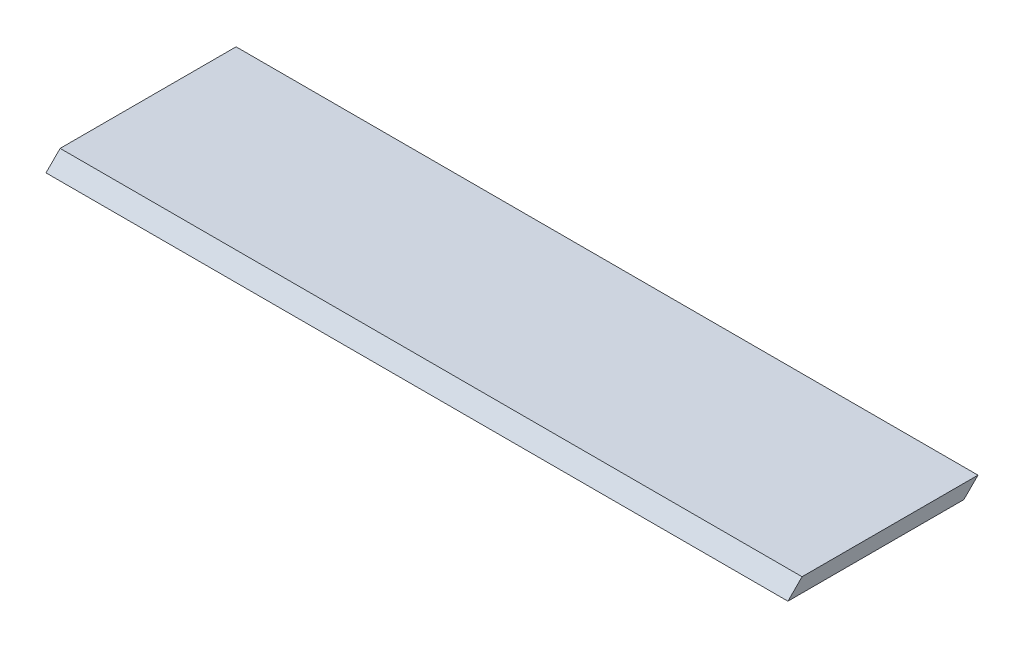
ISO-10303-21;
HEADER;
FILE_DESCRIPTION(('STEP AP214'),'2;1');
FILE_NAME('part.step','',(''),(''),'','','');
FILE_SCHEMA(('AUTOMOTIVE_DESIGN { 1 0 10303 214 1 1 1 1 }'));
ENDSEC;
DATA;
#1=APPLICATION_CONTEXT('core data for automotive mechanical design processes');
#2=APPLICATION_PROTOCOL_DEFINITION('international standard','automotive_design',2000,#1);
#3=PRODUCT_CONTEXT('',#1,'mechanical');
#4=PRODUCT('Part','Part','',(#3));
#5=PRODUCT_RELATED_PRODUCT_CATEGORY('part','',(#4));
#6=PRODUCT_DEFINITION_FORMATION('','',#4);
#7=PRODUCT_DEFINITION_CONTEXT('part definition',#1,'design');
#8=PRODUCT_DEFINITION('design','',#6,#7);
#9=PRODUCT_DEFINITION_SHAPE('','',#8);
#10=(LENGTH_UNIT() NAMED_UNIT(*) SI_UNIT(.MILLI.,.METRE.));
#11=(NAMED_UNIT(*) PLANE_ANGLE_UNIT() SI_UNIT($,.RADIAN.));
#12=(NAMED_UNIT(*) SI_UNIT($,.STERADIAN.) SOLID_ANGLE_UNIT());
#13=UNCERTAINTY_MEASURE_WITH_UNIT(LENGTH_MEASURE(1.E-05),#10,'distance_accuracy_value','');
#14=(GEOMETRIC_REPRESENTATION_CONTEXT(3) GLOBAL_UNCERTAINTY_ASSIGNED_CONTEXT((#13)) GLOBAL_UNIT_ASSIGNED_CONTEXT((#10,
#11,#12)) REPRESENTATION_CONTEXT('',''));
#15=CARTESIAN_POINT('',(0.,0.,0.));
#16=DIRECTION('',(0.,0.,1.));
#17=DIRECTION('',(1.,0.,0.));
#18=AXIS2_PLACEMENT_3D('',#15,#16,#17);
#19=CARTESIAN_POINT('',(-52.5000000000003,2.,-18.1181004448394));
#20=DIRECTION('',(1.,0.,0.));
#21=DIRECTION('',(0.,0.,-1.));
#22=AXIS2_PLACEMENT_3D('',#19,#20,#21);
#23=PLANE('',#22);
#24=DIRECTION('',(0.,0.,1.));
#25=VECTOR('',#24,1.);
#26=CARTESIAN_POINT('',(-52.5000000000003,2.,-18.1181004448394));
#27=LINE('',#26,#25);
#28=CARTESIAN_POINT('',(-52.5000000000003,2.,-18.1181004448394));
#29=VERTEX_POINT('',#28);
#30=CARTESIAN_POINT('',(-52.5,2.,6.78189955516055));
#31=VERTEX_POINT('',#30);
#32=EDGE_CURVE('E78',#29,#31,#27,.T.);
#33=ORIENTED_EDGE('',*,*,#32,.F.);
#34=DIRECTION('',(0.,-0.707106781186547,0.707106781186548));
#35=VECTOR('',#34,1.);
#36=CARTESIAN_POINT('',(-52.5000000000003,2.00000000000002,-18.1181004448394));
#37=LINE('',#36,#35);
#38=CARTESIAN_POINT('',(-52.5000000000003,0.,-16.1181004448394));
#39=VERTEX_POINT('',#38);
#40=EDGE_CURVE('E55',#29,#39,#37,.T.);
#41=ORIENTED_EDGE('',*,*,#40,.T.);
#42=DIRECTION('',(0.,0.,1.));
#43=VECTOR('',#42,1.);
#44=CARTESIAN_POINT('',(-52.5000000000003,0.,-18.1181004448394));
#45=LINE('',#44,#43);
#46=CARTESIAN_POINT('',(-52.5,0.,8.78189955516055));
#47=VERTEX_POINT('',#46);
#48=EDGE_CURVE('E95',#39,#47,#45,.T.);
#49=ORIENTED_EDGE('',*,*,#48,.T.);
#50=DIRECTION('',(0.,-0.707106781186548,0.707106781186548));
#51=VECTOR('',#50,1.);
#52=CARTESIAN_POINT('',(-52.5,1.99999999999964,6.78189955516092));
#53=LINE('',#52,#51);
#54=EDGE_CURVE('E75',#47,#31,#53,.F.);
#55=ORIENTED_EDGE('',*,*,#54,.T.);
#56=EDGE_LOOP('',(#33,#41,#49,#55));
#57=FACE_BOUND('',#56,.T.);
#58=ADVANCED_FACE('F33',(#57),#23,.F.);
#59=CARTESIAN_POINT('',(52.5,2.,-18.1181004448395));
#60=DIRECTION('',(-1.,0.,0.));
#61=DIRECTION('',(0.,0.,1.));
#62=AXIS2_PLACEMENT_3D('',#59,#60,#61);
#63=PLANE('',#62);
#64=DIRECTION('',(0.,0.,-1.));
#65=VECTOR('',#64,1.);
#66=CARTESIAN_POINT('',(52.5,0.,-18.1181004448395));
#67=LINE('',#66,#65);
#68=CARTESIAN_POINT('',(52.5,0.,8.78189955516057));
#69=VERTEX_POINT('',#68);
#70=CARTESIAN_POINT('',(52.5,0.,-16.1181004448394));
#71=VERTEX_POINT('',#70);
#72=EDGE_CURVE('E88',#69,#71,#67,.T.);
#73=ORIENTED_EDGE('',*,*,#72,.T.);
#74=DIRECTION('',(0.,0.707106781186547,-0.707106781186548));
#75=VECTOR('',#74,1.);
#76=CARTESIAN_POINT('',(52.5,2.00000000000001,-18.1181004448394));
#77=LINE('',#76,#75);
#78=CARTESIAN_POINT('',(52.5,2.,-18.1181004448395));
#79=VERTEX_POINT('',#78);
#80=EDGE_CURVE('E11',#71,#79,#77,.T.);
#81=ORIENTED_EDGE('',*,*,#80,.T.);
#82=DIRECTION('',(0.,0.,-1.));
#83=VECTOR('',#82,1.);
#84=CARTESIAN_POINT('',(52.5,2.,-18.1181004448395));
#85=LINE('',#84,#83);
#86=CARTESIAN_POINT('',(52.5,2.,6.78189955516056));
#87=VERTEX_POINT('',#86);
#88=EDGE_CURVE('E83',#87,#79,#85,.T.);
#89=ORIENTED_EDGE('',*,*,#88,.F.);
#90=DIRECTION('',(0.,0.707106781186548,-0.707106781186548));
#91=VECTOR('',#90,1.);
#92=CARTESIAN_POINT('',(52.5,2.,6.78189955516056));
#93=LINE('',#92,#91);
#94=EDGE_CURVE('E100',#87,#69,#93,.F.);
#95=ORIENTED_EDGE('',*,*,#94,.T.);
#96=EDGE_LOOP('',(#73,#81,#89,#95));
#97=FACE_BOUND('',#96,.T.);
#98=ADVANCED_FACE('F103',(#97),#63,.F.);
#99=CARTESIAN_POINT('',(0.,2.,0.));
#100=DIRECTION('',(0.,-1.,0.));
#101=DIRECTION('',(0.,0.,-1.));
#102=AXIS2_PLACEMENT_3D('',#99,#100,#101);
#103=PLANE('',#102);
#104=ORIENTED_EDGE('',*,*,#32,.T.);
#105=DIRECTION('',(1.,0.,0.));
#106=VECTOR('',#105,1.);
#107=CARTESIAN_POINT('',(0.,2.,6.78189955516056));
#108=LINE('',#107,#106);
#109=EDGE_CURVE('E94',#31,#87,#108,.T.);
#110=ORIENTED_EDGE('',*,*,#109,.T.);
#111=ORIENTED_EDGE('',*,*,#88,.T.);
#112=DIRECTION('',(-1.,0.,0.));
#113=VECTOR('',#112,1.);
#114=CARTESIAN_POINT('',(-52.5000000000003,2.,-18.1181004448394));
#115=LINE('',#114,#113);
#116=EDGE_CURVE('E74',#79,#29,#115,.T.);
#117=ORIENTED_EDGE('',*,*,#116,.T.);
#118=EDGE_LOOP('',(#104,#110,#111,#117));
#119=FACE_BOUND('',#118,.T.);
#120=ADVANCED_FACE('F86',(#119),#103,.F.);
#121=CARTESIAN_POINT('',(0.,0.,0.));
#122=DIRECTION('',(0.,-1.,0.));
#123=DIRECTION('',(0.,0.,-1.));
#124=AXIS2_PLACEMENT_3D('',#121,#122,#123);
#125=PLANE('',#124);
#126=ORIENTED_EDGE('',*,*,#48,.F.);
#127=DIRECTION('',(1.,0.,0.));
#128=VECTOR('',#127,1.);
#129=CARTESIAN_POINT('',(52.5,0.,-16.1181004448394));
#130=LINE('',#129,#128);
#131=EDGE_CURVE('E41',#39,#71,#130,.T.);
#132=ORIENTED_EDGE('',*,*,#131,.T.);
#133=ORIENTED_EDGE('',*,*,#72,.F.);
#134=DIRECTION('',(1.,0.,0.));
#135=VECTOR('',#134,1.);
#136=CARTESIAN_POINT('',(-52.5,0.,8.78189955516055));
#137=LINE('',#136,#135);
#138=EDGE_CURVE('E90',#47,#69,#137,.T.);
#139=ORIENTED_EDGE('',*,*,#138,.F.);
#140=EDGE_LOOP('',(#126,#132,#133,#139));
#141=FACE_BOUND('',#140,.T.);
#142=ADVANCED_FACE('F106',(#141),#125,.T.);
#143=CARTESIAN_POINT('',(0.,2.,6.78189955516056));
#144=DIRECTION('',(0.,-0.707106781186547,-0.707106781186547));
#145=DIRECTION('',(1.,0.,0.));
#146=AXIS2_PLACEMENT_3D('',#143,#144,#145);
#147=PLANE('',#146);
#148=ORIENTED_EDGE('',*,*,#54,.F.);
#149=ORIENTED_EDGE('',*,*,#138,.T.);
#150=ORIENTED_EDGE('',*,*,#94,.F.);
#151=ORIENTED_EDGE('',*,*,#109,.F.);
#152=EDGE_LOOP('',(#148,#149,#150,#151));
#153=FACE_BOUND('',#152,.T.);
#154=ADVANCED_FACE('F107',(#153),#147,.F.);
#155=CARTESIAN_POINT('',(-52.5000000000003,2.00000000000002,-18.1181004448394));
#156=DIRECTION('',(0.,-0.707106781186548,-0.707106781186547));
#157=DIRECTION('',(1.,0.,0.));
#158=AXIS2_PLACEMENT_3D('',#155,#156,#157);
#159=PLANE('',#158);
#160=ORIENTED_EDGE('',*,*,#80,.F.);
#161=ORIENTED_EDGE('',*,*,#131,.F.);
#162=ORIENTED_EDGE('',*,*,#40,.F.);
#163=ORIENTED_EDGE('',*,*,#116,.F.);
#164=EDGE_LOOP('',(#160,#161,#162,#163));
#165=FACE_BOUND('',#164,.T.);
#166=ADVANCED_FACE('F35',(#165),#159,.T.);
#167=CLOSED_SHELL('',(#58,#98,#120,#142,#154,#166));
#168=MANIFOLD_SOLID_BREP('B2',#167);
#169=ADVANCED_BREP_SHAPE_REPRESENTATION('',(#18,#168),#14);
#170=SHAPE_DEFINITION_REPRESENTATION(#9,#169);
ENDSEC;
END-ISO-10303-21;
